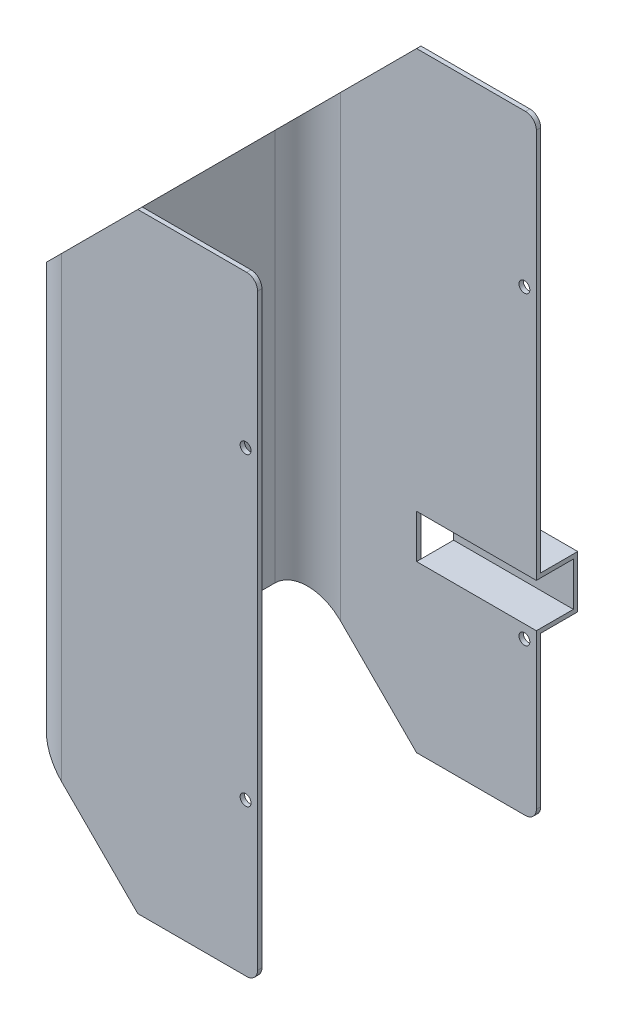
ISO-10303-21;
HEADER;
FILE_DESCRIPTION(('STEP AP214'),'2;1');
FILE_NAME('part.step','',(''),(''),'','','');
FILE_SCHEMA(('AUTOMOTIVE_DESIGN { 1 0 10303 214 1 1 1 1 }'));
ENDSEC;
DATA;
#1=APPLICATION_CONTEXT('core data for automotive mechanical design processes');
#2=APPLICATION_PROTOCOL_DEFINITION('international standard','automotive_design',2000,#1);
#3=PRODUCT_CONTEXT('',#1,'mechanical');
#4=PRODUCT('Part','Part','',(#3));
#5=PRODUCT_RELATED_PRODUCT_CATEGORY('part','',(#4));
#6=PRODUCT_DEFINITION_FORMATION('','',#4);
#7=PRODUCT_DEFINITION_CONTEXT('part definition',#1,'design');
#8=PRODUCT_DEFINITION('design','',#6,#7);
#9=PRODUCT_DEFINITION_SHAPE('','',#8);
#10=(LENGTH_UNIT() NAMED_UNIT(*) SI_UNIT(.MILLI.,.METRE.));
#11=(NAMED_UNIT(*) PLANE_ANGLE_UNIT() SI_UNIT($,.RADIAN.));
#12=(NAMED_UNIT(*) SI_UNIT($,.STERADIAN.) SOLID_ANGLE_UNIT());
#13=UNCERTAINTY_MEASURE_WITH_UNIT(LENGTH_MEASURE(1.E-05),#10,'distance_accuracy_value','');
#14=(GEOMETRIC_REPRESENTATION_CONTEXT(3) GLOBAL_UNCERTAINTY_ASSIGNED_CONTEXT((#13)) GLOBAL_UNIT_ASSIGNED_CONTEXT((#10,
#11,#12)) REPRESENTATION_CONTEXT('',''));
#15=CARTESIAN_POINT('',(0.,0.,0.));
#16=DIRECTION('',(0.,0.,1.));
#17=DIRECTION('',(1.,0.,0.));
#18=AXIS2_PLACEMENT_3D('',#15,#16,#17);
#19=CARTESIAN_POINT('',(15.,280.,-65.));
#20=DIRECTION('',(0.,0.,-1.));
#21=DIRECTION('',(-1.,0.,0.));
#22=AXIS2_PLACEMENT_3D('',#19,#20,#21);
#23=PLANE('',#22);
#24=CARTESIAN_POINT('',(99.5,70.,-65.));
#25=DIRECTION('',(0.,0.,1.));
#26=DIRECTION('',(1.,0.,0.));
#27=AXIS2_PLACEMENT_3D('',#24,#25,#26);
#28=CIRCLE('',#27,2.5);
#29=CARTESIAN_POINT('',(102.,70.,-65.));
#30=VERTEX_POINT('',#29);
#31=EDGE_CURVE('E354',#30,#30,#28,.T.);
#32=ORIENTED_EDGE('',*,*,#31,.T.);
#33=EDGE_LOOP('',(#32));
#34=FACE_BOUND('',#33,.T.);
#35=CARTESIAN_POINT('',(99.5,210.,-65.));
#36=DIRECTION('',(0.,0.,1.));
#37=DIRECTION('',(1.,0.,0.));
#38=AXIS2_PLACEMENT_3D('',#35,#36,#37);
#39=CIRCLE('',#38,2.50000000000001);
#40=CARTESIAN_POINT('',(102.,210.,-65.));
#41=VERTEX_POINT('',#40);
#42=EDGE_CURVE('E364',#41,#41,#39,.T.);
#43=ORIENTED_EDGE('',*,*,#42,.T.);
#44=EDGE_LOOP('',(#43));
#45=FACE_BOUND('',#44,.T.);
#46=DIRECTION('',(0.,-1.,0.));
#47=VECTOR('',#46,1.);
#48=CARTESIAN_POINT('',(105.,280.,-65.));
#49=LINE('',#48,#47);
#50=CARTESIAN_POINT('',(105.,275.,-65.));
#51=VERTEX_POINT('',#50);
#52=CARTESIAN_POINT('',(105.,98.,-65.));
#53=VERTEX_POINT('',#52);
#54=EDGE_CURVE('E422',#51,#53,#49,.T.);
#55=ORIENTED_EDGE('',*,*,#54,.T.);
#56=DIRECTION('',(-1.,0.,0.));
#57=VECTOR('',#56,1.);
#58=CARTESIAN_POINT('',(134.410882339705,98.,-65.));
#59=LINE('',#58,#57);
#60=CARTESIAN_POINT('',(50.,98.,-65.));
#61=VERTEX_POINT('',#60);
#62=EDGE_CURVE('E241',#53,#61,#59,.T.);
#63=ORIENTED_EDGE('',*,*,#62,.T.);
#64=DIRECTION('',(0.,-1.,0.));
#65=VECTOR('',#64,1.);
#66=CARTESIAN_POINT('',(50.,98.,-65.));
#67=LINE('',#66,#65);
#68=CARTESIAN_POINT('',(50.,96.,-65.));
#69=VERTEX_POINT('',#68);
#70=EDGE_CURVE('E259',#61,#69,#67,.T.);
#71=ORIENTED_EDGE('',*,*,#70,.T.);
#72=DIRECTION('',(0.,1.,0.));
#73=VECTOR('',#72,1.);
#74=CARTESIAN_POINT('',(50.,96.,-65.));
#75=LINE('',#74,#73);
#76=CARTESIAN_POINT('',(50.,76.,-65.));
#77=VERTEX_POINT('',#76);
#78=EDGE_CURVE('E252',#77,#69,#75,.T.);
#79=ORIENTED_EDGE('',*,*,#78,.F.);
#80=DIRECTION('',(0.,-1.,0.));
#81=VECTOR('',#80,1.);
#82=CARTESIAN_POINT('',(50.,76.,-65.));
#83=LINE('',#82,#81);
#84=CARTESIAN_POINT('',(50.,74.,-65.));
#85=VERTEX_POINT('',#84);
#86=EDGE_CURVE('E274',#77,#85,#83,.T.);
#87=ORIENTED_EDGE('',*,*,#86,.T.);
#88=DIRECTION('',(-1.,0.,0.));
#89=VECTOR('',#88,1.);
#90=CARTESIAN_POINT('',(134.410882339705,74.,-65.));
#91=LINE('',#90,#89);
#92=CARTESIAN_POINT('',(105.,74.,-65.));
#93=VERTEX_POINT('',#92);
#94=EDGE_CURVE('E271',#93,#85,#91,.T.);
#95=ORIENTED_EDGE('',*,*,#94,.F.);
#96=CARTESIAN_POINT('',(105.,5.,-65.));
#97=VERTEX_POINT('',#96);
#98=EDGE_CURVE('E421',#93,#97,#49,.T.);
#99=ORIENTED_EDGE('',*,*,#98,.T.);
#100=CARTESIAN_POINT('',(100.,5.,-65.));
#101=DIRECTION('',(0.,0.,-1.));
#102=DIRECTION('',(-1.,0.,0.));
#103=AXIS2_PLACEMENT_3D('',#100,#101,#102);
#104=CIRCLE('',#103,5.);
#105=CARTESIAN_POINT('',(100.,0.,-65.));
#106=VERTEX_POINT('',#105);
#107=EDGE_CURVE('E451',#97,#106,#104,.T.);
#108=ORIENTED_EDGE('',*,*,#107,.T.);
#109=DIRECTION('',(1.,0.,0.));
#110=VECTOR('',#109,1.);
#111=CARTESIAN_POINT('',(15.,0.,-65.));
#112=LINE('',#111,#110);
#113=CARTESIAN_POINT('',(50.,0.,-65.));
#114=VERTEX_POINT('',#113);
#115=EDGE_CURVE('E388',#114,#106,#112,.T.);
#116=ORIENTED_EDGE('',*,*,#115,.F.);
#117=DIRECTION('',(-0.707106781186547,0.707106781186547,0.));
#118=VECTOR('',#117,1.);
#119=CARTESIAN_POINT('',(50.,0.,-65.));
#120=LINE('',#119,#118);
#121=CARTESIAN_POINT('',(15.,35.,-65.));
#122=VERTEX_POINT('',#121);
#123=EDGE_CURVE('E294',#114,#122,#120,.T.);
#124=ORIENTED_EDGE('',*,*,#123,.T.);
#125=DIRECTION('',(0.,-1.,0.));
#126=VECTOR('',#125,1.);
#127=CARTESIAN_POINT('',(15.,280.,-65.));
#128=LINE('',#127,#126);
#129=CARTESIAN_POINT('',(15.,245.,-65.));
#130=VERTEX_POINT('',#129);
#131=EDGE_CURVE('E418',#130,#122,#128,.T.);
#132=ORIENTED_EDGE('',*,*,#131,.F.);
#133=DIRECTION('',(0.707106781186547,0.707106781186547,0.));
#134=VECTOR('',#133,1.);
#135=CARTESIAN_POINT('',(50.,280.,-65.));
#136=LINE('',#135,#134);
#137=CARTESIAN_POINT('',(50.,280.,-65.));
#138=VERTEX_POINT('',#137);
#139=EDGE_CURVE('E323',#130,#138,#136,.T.);
#140=ORIENTED_EDGE('',*,*,#139,.T.);
#141=DIRECTION('',(1.,0.,0.));
#142=VECTOR('',#141,1.);
#143=CARTESIAN_POINT('',(15.,280.,-65.));
#144=LINE('',#143,#142);
#145=CARTESIAN_POINT('',(100.,280.,-65.));
#146=VERTEX_POINT('',#145);
#147=EDGE_CURVE('E377',#138,#146,#144,.T.);
#148=ORIENTED_EDGE('',*,*,#147,.T.);
#149=CARTESIAN_POINT('',(100.,275.,-65.));
#150=DIRECTION('',(0.,0.,-1.));
#151=DIRECTION('',(-1.,0.,0.));
#152=AXIS2_PLACEMENT_3D('',#149,#150,#151);
#153=CIRCLE('',#152,5.);
#154=EDGE_CURVE('E449',#146,#51,#153,.T.);
#155=ORIENTED_EDGE('',*,*,#154,.T.);
#156=EDGE_LOOP('',(#55,#63,#71,#79,#87,#95,#99,#108,#116,#124,#132,#140,#148,#155));
#157=FACE_BOUND('',#156,.T.);
#158=ADVANCED_FACE('F34',(#34,#45,#157),#23,.T.);
#159=CARTESIAN_POINT('',(-1.99999999999998,0.,-48.));
#160=DIRECTION('',(0.,-1.,0.));
#161=DIRECTION('',(0.,0.,-1.));
#162=AXIS2_PLACEMENT_3D('',#159,#160,#161);
#163=PLANE('',#162);
#164=ORIENTED_EDGE('',*,*,#115,.T.);
#165=DIRECTION('',(0.,0.,1.));
#166=VECTOR('',#165,1.);
#167=CARTESIAN_POINT('',(100.,0.,-48.));
#168=LINE('',#167,#166);
#169=CARTESIAN_POINT('',(100.,0.,-63.));
#170=VERTEX_POINT('',#169);
#171=EDGE_CURVE('E435',#106,#170,#168,.T.);
#172=ORIENTED_EDGE('',*,*,#171,.T.);
#173=DIRECTION('',(1.,0.,0.));
#174=VECTOR('',#173,1.);
#175=CARTESIAN_POINT('',(15.,0.,-63.));
#176=LINE('',#175,#174);
#177=CARTESIAN_POINT('',(50.,0.,-63.));
#178=VERTEX_POINT('',#177);
#179=EDGE_CURVE('E373',#178,#170,#176,.T.);
#180=ORIENTED_EDGE('',*,*,#179,.F.);
#181=DIRECTION('',(0.,0.,1.));
#182=VECTOR('',#181,1.);
#183=CARTESIAN_POINT('',(50.,0.,-65.));
#184=LINE('',#183,#182);
#185=EDGE_CURVE('E299',#114,#178,#184,.T.);
#186=ORIENTED_EDGE('',*,*,#185,.F.);
#187=EDGE_LOOP('',(#164,#172,#180,#186));
#188=FACE_BOUND('',#187,.T.);
#189=ADVANCED_FACE('F558',(#188),#163,.T.);
#190=CARTESIAN_POINT('',(-1.99999999999998,280.,48.));
#191=DIRECTION('',(0.,1.,0.));
#192=DIRECTION('',(0.,0.,1.));
#193=AXIS2_PLACEMENT_3D('',#190,#191,#192);
#194=PLANE('',#193);
#195=DIRECTION('',(-1.,0.,0.));
#196=VECTOR('',#195,1.);
#197=CARTESIAN_POINT('',(15.,280.,65.));
#198=LINE('',#197,#196);
#199=CARTESIAN_POINT('',(100.,280.,65.));
#200=VERTEX_POINT('',#199);
#201=CARTESIAN_POINT('',(50.,280.,65.));
#202=VERTEX_POINT('',#201);
#203=EDGE_CURVE('E381',#200,#202,#198,.T.);
#204=ORIENTED_EDGE('',*,*,#203,.F.);
#205=DIRECTION('',(0.,0.,1.));
#206=VECTOR('',#205,1.);
#207=CARTESIAN_POINT('',(100.,280.,48.));
#208=LINE('',#207,#206);
#209=CARTESIAN_POINT('',(100.,280.,63.));
#210=VERTEX_POINT('',#209);
#211=EDGE_CURVE('E42',#200,#210,#208,.F.);
#212=ORIENTED_EDGE('',*,*,#211,.T.);
#213=DIRECTION('',(-1.,0.,0.));
#214=VECTOR('',#213,1.);
#215=CARTESIAN_POINT('',(15.,280.,63.));
#216=LINE('',#215,#214);
#217=CARTESIAN_POINT('',(50.,280.,63.));
#218=VERTEX_POINT('',#217);
#219=EDGE_CURVE('E383',#210,#218,#216,.T.);
#220=ORIENTED_EDGE('',*,*,#219,.T.);
#221=DIRECTION('',(0.,0.,1.));
#222=VECTOR('',#221,1.);
#223=CARTESIAN_POINT('',(50.,280.,-65.));
#224=LINE('',#223,#222);
#225=EDGE_CURVE('E333',#218,#202,#224,.T.);
#226=ORIENTED_EDGE('',*,*,#225,.T.);
#227=EDGE_LOOP('',(#204,#212,#220,#226));
#228=FACE_BOUND('',#227,.T.);
#229=ADVANCED_FACE('F491',(#228),#194,.T.);
#230=CARTESIAN_POINT('',(15.,280.,-63.));
#231=DIRECTION('',(0.,0.,-1.));
#232=DIRECTION('',(-1.,0.,0.));
#233=AXIS2_PLACEMENT_3D('',#230,#231,#232);
#234=PLANE('',#233);
#235=CARTESIAN_POINT('',(99.5,70.,-63.));
#236=DIRECTION('',(0.,0.,-1.));
#237=DIRECTION('',(-1.,0.,0.));
#238=AXIS2_PLACEMENT_3D('',#235,#236,#237);
#239=CIRCLE('',#238,2.5);
#240=CARTESIAN_POINT('',(97.,70.,-63.));
#241=VERTEX_POINT('',#240);
#242=EDGE_CURVE('E360',#241,#241,#239,.T.);
#243=ORIENTED_EDGE('',*,*,#242,.T.);
#244=EDGE_LOOP('',(#243));
#245=FACE_BOUND('',#244,.T.);
#246=CARTESIAN_POINT('',(99.5,210.,-63.));
#247=DIRECTION('',(0.,0.,-1.));
#248=DIRECTION('',(-1.,0.,0.));
#249=AXIS2_PLACEMENT_3D('',#246,#247,#248);
#250=CIRCLE('',#249,2.50000000000001);
#251=CARTESIAN_POINT('',(97.,210.,-63.));
#252=VERTEX_POINT('',#251);
#253=EDGE_CURVE('E370',#252,#252,#250,.T.);
#254=ORIENTED_EDGE('',*,*,#253,.T.);
#255=EDGE_LOOP('',(#254));
#256=FACE_BOUND('',#255,.T.);
#257=DIRECTION('',(0.,-1.,0.));
#258=VECTOR('',#257,1.);
#259=CARTESIAN_POINT('',(50.,96.,-63.));
#260=LINE('',#259,#258);
#261=CARTESIAN_POINT('',(50.,96.,-63.));
#262=VERTEX_POINT('',#261);
#263=CARTESIAN_POINT('',(50.,76.,-63.));
#264=VERTEX_POINT('',#263);
#265=EDGE_CURVE('E278',#262,#264,#260,.T.);
#266=ORIENTED_EDGE('',*,*,#265,.F.);
#267=DIRECTION('',(-1.,0.,0.));
#268=VECTOR('',#267,1.);
#269=CARTESIAN_POINT('',(105.,96.,-63.));
#270=LINE('',#269,#268);
#271=CARTESIAN_POINT('',(105.,96.,-63.));
#272=VERTEX_POINT('',#271);
#273=EDGE_CURVE('E280',#272,#262,#270,.T.);
#274=ORIENTED_EDGE('',*,*,#273,.F.);
#275=DIRECTION('',(0.,-1.,0.));
#276=VECTOR('',#275,1.);
#277=CARTESIAN_POINT('',(105.,280.,-63.));
#278=LINE('',#277,#276);
#279=CARTESIAN_POINT('',(105.,275.,-63.));
#280=VERTEX_POINT('',#279);
#281=EDGE_CURVE('E425',#280,#272,#278,.T.);
#282=ORIENTED_EDGE('',*,*,#281,.F.);
#283=CARTESIAN_POINT('',(100.,275.,-63.));
#284=DIRECTION('',(0.,0.,-1.));
#285=DIRECTION('',(-1.,0.,0.));
#286=AXIS2_PLACEMENT_3D('',#283,#284,#285);
#287=CIRCLE('',#286,5.);
#288=CARTESIAN_POINT('',(100.,280.,-63.));
#289=VERTEX_POINT('',#288);
#290=EDGE_CURVE('E438',#280,#289,#287,.F.);
#291=ORIENTED_EDGE('',*,*,#290,.T.);
#292=DIRECTION('',(1.,0.,0.));
#293=VECTOR('',#292,1.);
#294=CARTESIAN_POINT('',(15.,280.,-63.));
#295=LINE('',#294,#293);
#296=CARTESIAN_POINT('',(50.,280.,-63.));
#297=VERTEX_POINT('',#296);
#298=EDGE_CURVE('E374',#297,#289,#295,.T.);
#299=ORIENTED_EDGE('',*,*,#298,.F.);
#300=DIRECTION('',(-0.707106781186548,-0.707106781186548,0.));
#301=VECTOR('',#300,1.);
#302=CARTESIAN_POINT('',(32.5,262.5,-63.));
#303=LINE('',#302,#301);
#304=CARTESIAN_POINT('',(15.,245.,-63.));
#305=VERTEX_POINT('',#304);
#306=EDGE_CURVE('E346',#297,#305,#303,.T.);
#307=ORIENTED_EDGE('',*,*,#306,.T.);
#308=DIRECTION('',(0.,-1.,0.));
#309=VECTOR('',#308,1.);
#310=CARTESIAN_POINT('',(15.,280.,-63.));
#311=LINE('',#310,#309);
#312=CARTESIAN_POINT('',(15.,35.,-63.));
#313=VERTEX_POINT('',#312);
#314=EDGE_CURVE('E385',#305,#313,#311,.T.);
#315=ORIENTED_EDGE('',*,*,#314,.T.);
#316=DIRECTION('',(0.707106781186548,-0.707106781186548,0.));
#317=VECTOR('',#316,1.);
#318=CARTESIAN_POINT('',(-107.5,157.5,-62.9999999999999));
#319=LINE('',#318,#317);
#320=EDGE_CURVE('E315',#313,#178,#319,.T.);
#321=ORIENTED_EDGE('',*,*,#320,.T.);
#322=ORIENTED_EDGE('',*,*,#179,.T.);
#323=CARTESIAN_POINT('',(100.,5.,-63.));
#324=DIRECTION('',(0.,0.,-1.));
#325=DIRECTION('',(-1.,0.,0.));
#326=AXIS2_PLACEMENT_3D('',#323,#324,#325);
#327=CIRCLE('',#326,5.);
#328=CARTESIAN_POINT('',(105.,5.,-63.));
#329=VERTEX_POINT('',#328);
#330=EDGE_CURVE('E440',#170,#329,#327,.F.);
#331=ORIENTED_EDGE('',*,*,#330,.T.);
#332=CARTESIAN_POINT('',(105.,76.,-63.));
#333=VERTEX_POINT('',#332);
#334=EDGE_CURVE('E424',#333,#329,#278,.T.);
#335=ORIENTED_EDGE('',*,*,#334,.F.);
#336=DIRECTION('',(1.,0.,0.));
#337=VECTOR('',#336,1.);
#338=CARTESIAN_POINT('',(105.,76.,-63.));
#339=LINE('',#338,#337);
#340=EDGE_CURVE('E282',#264,#333,#339,.T.);
#341=ORIENTED_EDGE('',*,*,#340,.F.);
#342=EDGE_LOOP('',(#266,#274,#282,#291,#299,#307,#315,#321,#322,#331,#335,#341));
#343=FACE_BOUND('',#342,.T.);
#344=ADVANCED_FACE('F508',(#245,#256,#343),#234,.F.);
#345=CARTESIAN_POINT('',(105.,280.,-65.));
#346=DIRECTION('',(1.,0.,0.));
#347=DIRECTION('',(0.,0.,-1.));
#348=AXIS2_PLACEMENT_3D('',#345,#346,#347);
#349=PLANE('',#348);
#350=DIRECTION('',(0.,0.,-1.));
#351=VECTOR('',#350,1.);
#352=CARTESIAN_POINT('',(105.,76.,-4.4765004464019));
#353=LINE('',#352,#351);
#354=CARTESIAN_POINT('',(105.,76.,-80.));
#355=VERTEX_POINT('',#354);
#356=EDGE_CURVE('E255',#333,#355,#353,.T.);
#357=ORIENTED_EDGE('',*,*,#356,.F.);
#358=ORIENTED_EDGE('',*,*,#334,.T.);
#359=DIRECTION('',(0.,0.,1.));
#360=VECTOR('',#359,1.);
#361=CARTESIAN_POINT('',(105.,5.,-65.));
#362=LINE('',#361,#360);
#363=EDGE_CURVE('E446',#329,#97,#362,.F.);
#364=ORIENTED_EDGE('',*,*,#363,.T.);
#365=ORIENTED_EDGE('',*,*,#98,.F.);
#366=DIRECTION('',(0.,0.,-1.));
#367=VECTOR('',#366,1.);
#368=CARTESIAN_POINT('',(105.,74.,-82.));
#369=LINE('',#368,#367);
#370=CARTESIAN_POINT('',(105.,74.,-82.));
#371=VERTEX_POINT('',#370);
#372=EDGE_CURVE('E251',#93,#371,#369,.T.);
#373=ORIENTED_EDGE('',*,*,#372,.T.);
#374=DIRECTION('',(0.,1.,0.));
#375=VECTOR('',#374,1.);
#376=CARTESIAN_POINT('',(105.,98.,-82.));
#377=LINE('',#376,#375);
#378=CARTESIAN_POINT('',(105.,98.,-82.));
#379=VERTEX_POINT('',#378);
#380=EDGE_CURVE('E229',#371,#379,#377,.T.);
#381=ORIENTED_EDGE('',*,*,#380,.T.);
#382=DIRECTION('',(0.,0.,1.));
#383=VECTOR('',#382,1.);
#384=CARTESIAN_POINT('',(105.,98.,-65.));
#385=LINE('',#384,#383);
#386=EDGE_CURVE('E238',#379,#53,#385,.T.);
#387=ORIENTED_EDGE('',*,*,#386,.T.);
#388=ORIENTED_EDGE('',*,*,#54,.F.);
#389=DIRECTION('',(0.,0.,1.));
#390=VECTOR('',#389,1.);
#391=CARTESIAN_POINT('',(105.,275.,-65.));
#392=LINE('',#391,#390);
#393=EDGE_CURVE('E443',#51,#280,#392,.T.);
#394=ORIENTED_EDGE('',*,*,#393,.T.);
#395=ORIENTED_EDGE('',*,*,#281,.T.);
#396=DIRECTION('',(0.,0.,-1.));
#397=VECTOR('',#396,1.);
#398=CARTESIAN_POINT('',(105.,96.,-4.4765004464019));
#399=LINE('',#398,#397);
#400=CARTESIAN_POINT('',(105.,96.,-80.));
#401=VERTEX_POINT('',#400);
#402=EDGE_CURVE('E281',#272,#401,#399,.T.);
#403=ORIENTED_EDGE('',*,*,#402,.T.);
#404=DIRECTION('',(0.,-1.,0.));
#405=VECTOR('',#404,1.);
#406=CARTESIAN_POINT('',(105.,96.,-80.));
#407=LINE('',#406,#405);
#408=EDGE_CURVE('E245',#401,#355,#407,.T.);
#409=ORIENTED_EDGE('',*,*,#408,.T.);
#410=EDGE_LOOP('',(#357,#358,#364,#365,#373,#381,#387,#388,#394,#395,#403,#409));
#411=FACE_BOUND('',#410,.T.);
#412=ADVANCED_FACE('F249',(#411),#349,.T.);
#413=CARTESIAN_POINT('',(15.,280.,-48.));
#414=DIRECTION('',(0.,-1.,0.));
#415=DIRECTION('',(0.,0.,-1.));
#416=AXIS2_PLACEMENT_3D('',#413,#414,#415);
#417=CYLINDRICAL_SURFACE('',#416,17.);
#418=CARTESIAN_POINT('',(15.,35.,-48.));
#419=DIRECTION('',(0.707106781186547,0.707106781186547,0.));
#420=DIRECTION('',(0.707106781186548,-0.707106781186548,0.));
#421=AXIS2_PLACEMENT_3D('',#418,#419,#420);
#422=ELLIPSE('',#421,24.0416305603426,17.);
#423=CARTESIAN_POINT('',(-1.99999999999998,52.,-48.));
#424=VERTEX_POINT('',#423);
#425=EDGE_CURVE('E320',#424,#122,#422,.F.);
#426=ORIENTED_EDGE('',*,*,#425,.F.);
#427=DIRECTION('',(0.,-1.,0.));
#428=VECTOR('',#427,1.);
#429=CARTESIAN_POINT('',(-1.99999999999998,280.,-48.));
#430=LINE('',#429,#428);
#431=CARTESIAN_POINT('',(-1.99999999999998,228.,-48.));
#432=VERTEX_POINT('',#431);
#433=EDGE_CURVE('E415',#432,#424,#430,.T.);
#434=ORIENTED_EDGE('',*,*,#433,.F.);
#435=CARTESIAN_POINT('',(15.,245.,-48.));
#436=DIRECTION('',(0.707106781186547,-0.707106781186547,0.));
#437=DIRECTION('',(-0.707106781186548,-0.707106781186548,0.));
#438=AXIS2_PLACEMENT_3D('',#435,#436,#437);
#439=ELLIPSE('',#438,24.0416305603426,17.);
#440=EDGE_CURVE('E351',#130,#432,#439,.F.);
#441=ORIENTED_EDGE('',*,*,#440,.F.);
#442=ORIENTED_EDGE('',*,*,#131,.T.);
#443=EDGE_LOOP('',(#426,#434,#441,#442));
#444=FACE_BOUND('',#443,.T.);
#445=ADVANCED_FACE('F587',(#444),#417,.T.);
#446=CARTESIAN_POINT('',(-1.99999999999998,280.,-48.));
#447=DIRECTION('',(-1.,0.,0.));
#448=DIRECTION('',(0.,0.,1.));
#449=AXIS2_PLACEMENT_3D('',#446,#447,#448);
#450=PLANE('',#449);
#451=DIRECTION('',(0.,0.,1.));
#452=VECTOR('',#451,1.);
#453=CARTESIAN_POINT('',(-1.99999999999998,52.,-65.));
#454=LINE('',#453,#452);
#455=CARTESIAN_POINT('',(-1.99999999999998,52.,48.));
#456=VERTEX_POINT('',#455);
#457=EDGE_CURVE('E297',#424,#456,#454,.T.);
#458=ORIENTED_EDGE('',*,*,#457,.T.);
#459=DIRECTION('',(0.,-1.,0.));
#460=VECTOR('',#459,1.);
#461=CARTESIAN_POINT('',(-1.99999999999998,280.,48.));
#462=LINE('',#461,#460);
#463=CARTESIAN_POINT('',(-1.99999999999998,228.,48.));
#464=VERTEX_POINT('',#463);
#465=EDGE_CURVE('E412',#464,#456,#462,.T.);
#466=ORIENTED_EDGE('',*,*,#465,.F.);
#467=DIRECTION('',(0.,0.,1.));
#468=VECTOR('',#467,1.);
#469=CARTESIAN_POINT('',(-1.99999999999998,228.,-65.));
#470=LINE('',#469,#468);
#471=EDGE_CURVE('E326',#432,#464,#470,.T.);
#472=ORIENTED_EDGE('',*,*,#471,.F.);
#473=ORIENTED_EDGE('',*,*,#433,.T.);
#474=EDGE_LOOP('',(#458,#466,#472,#473));
#475=FACE_BOUND('',#474,.T.);
#476=ADVANCED_FACE('F644',(#475),#450,.T.);
#477=CARTESIAN_POINT('',(15.,280.,48.));
#478=DIRECTION('',(0.,-1.,0.));
#479=DIRECTION('',(0.,0.,-1.));
#480=AXIS2_PLACEMENT_3D('',#477,#478,#479);
#481=CYLINDRICAL_SURFACE('',#480,17.);
#482=CARTESIAN_POINT('',(15.,35.,48.));
#483=DIRECTION('',(0.707106781186547,0.707106781186547,0.));
#484=DIRECTION('',(0.707106781186548,-0.707106781186548,0.));
#485=AXIS2_PLACEMENT_3D('',#482,#483,#484);
#486=ELLIPSE('',#485,24.0416305603426,17.);
#487=CARTESIAN_POINT('',(15.,35.,65.));
#488=VERTEX_POINT('',#487);
#489=EDGE_CURVE('E318',#488,#456,#486,.F.);
#490=ORIENTED_EDGE('',*,*,#489,.F.);
#491=DIRECTION('',(0.,-1.,0.));
#492=VECTOR('',#491,1.);
#493=CARTESIAN_POINT('',(15.,280.,65.));
#494=LINE('',#493,#492);
#495=CARTESIAN_POINT('',(15.,245.,65.));
#496=VERTEX_POINT('',#495);
#497=EDGE_CURVE('E409',#496,#488,#494,.T.);
#498=ORIENTED_EDGE('',*,*,#497,.F.);
#499=CARTESIAN_POINT('',(15.,245.,48.));
#500=DIRECTION('',(0.707106781186547,-0.707106781186547,0.));
#501=DIRECTION('',(-0.707106781186548,-0.707106781186548,0.));
#502=AXIS2_PLACEMENT_3D('',#499,#500,#501);
#503=ELLIPSE('',#502,24.0416305603426,17.);
#504=EDGE_CURVE('E349',#464,#496,#503,.F.);
#505=ORIENTED_EDGE('',*,*,#504,.F.);
#506=ORIENTED_EDGE('',*,*,#465,.T.);
#507=EDGE_LOOP('',(#490,#498,#505,#506));
#508=FACE_BOUND('',#507,.T.);
#509=ADVANCED_FACE('F642',(#508),#481,.T.);
#510=CARTESIAN_POINT('',(15.,280.,65.));
#511=DIRECTION('',(0.,0.,1.));
#512=DIRECTION('',(1.,0.,0.));
#513=AXIS2_PLACEMENT_3D('',#510,#511,#512);
#514=PLANE('',#513);
#515=DIRECTION('',(-1.,0.,0.));
#516=VECTOR('',#515,1.);
#517=CARTESIAN_POINT('',(15.,0.,65.));
#518=LINE('',#517,#516);
#519=CARTESIAN_POINT('',(100.,0.,65.));
#520=VERTEX_POINT('',#519);
#521=CARTESIAN_POINT('',(50.,0.,65.));
#522=VERTEX_POINT('',#521);
#523=EDGE_CURVE('E391',#520,#522,#518,.T.);
#524=ORIENTED_EDGE('',*,*,#523,.F.);
#525=CARTESIAN_POINT('',(100.,5.,65.));
#526=DIRECTION('',(0.,0.,1.));
#527=DIRECTION('',(1.,0.,0.));
#528=AXIS2_PLACEMENT_3D('',#525,#526,#527);
#529=CIRCLE('',#528,5.);
#530=CARTESIAN_POINT('',(105.,5.,65.));
#531=VERTEX_POINT('',#530);
#532=EDGE_CURVE('E458',#520,#531,#529,.T.);
#533=ORIENTED_EDGE('',*,*,#532,.T.);
#534=DIRECTION('',(0.,-1.,0.));
#535=VECTOR('',#534,1.);
#536=CARTESIAN_POINT('',(105.,280.,65.));
#537=LINE('',#536,#535);
#538=CARTESIAN_POINT('',(105.,275.,65.));
#539=VERTEX_POINT('',#538);
#540=EDGE_CURVE('E407',#539,#531,#537,.T.);
#541=ORIENTED_EDGE('',*,*,#540,.F.);
#542=CARTESIAN_POINT('',(100.,275.,65.));
#543=DIRECTION('',(0.,0.,1.));
#544=DIRECTION('',(1.,0.,0.));
#545=AXIS2_PLACEMENT_3D('',#542,#543,#544);
#546=CIRCLE('',#545,5.);
#547=EDGE_CURVE('E456',#539,#200,#546,.T.);
#548=ORIENTED_EDGE('',*,*,#547,.T.);
#549=ORIENTED_EDGE('',*,*,#203,.T.);
#550=DIRECTION('',(0.707106781186547,0.707106781186547,0.));
#551=VECTOR('',#550,1.);
#552=CARTESIAN_POINT('',(50.,280.,65.));
#553=LINE('',#552,#551);
#554=EDGE_CURVE('E322',#496,#202,#553,.T.);
#555=ORIENTED_EDGE('',*,*,#554,.F.);
#556=ORIENTED_EDGE('',*,*,#497,.T.);
#557=DIRECTION('',(-0.707106781186547,0.707106781186547,0.));
#558=VECTOR('',#557,1.);
#559=CARTESIAN_POINT('',(50.,0.,65.));
#560=LINE('',#559,#558);
#561=EDGE_CURVE('E293',#522,#488,#560,.T.);
#562=ORIENTED_EDGE('',*,*,#561,.F.);
#563=EDGE_LOOP('',(#524,#533,#541,#548,#549,#555,#556,#562));
#564=FACE_BOUND('',#563,.T.);
#565=CARTESIAN_POINT('',(99.5,70.,65.));
#566=DIRECTION('',(0.,0.,1.));
#567=DIRECTION('',(1.,0.,0.));
#568=AXIS2_PLACEMENT_3D('',#565,#566,#567);
#569=CIRCLE('',#568,2.5);
#570=CARTESIAN_POINT('',(102.,70.,65.));
#571=VERTEX_POINT('',#570);
#572=EDGE_CURVE('E353',#571,#571,#569,.T.);
#573=ORIENTED_EDGE('',*,*,#572,.F.);
#574=EDGE_LOOP('',(#573));
#575=FACE_BOUND('',#574,.T.);
#576=CARTESIAN_POINT('',(99.5,210.,65.));
#577=DIRECTION('',(0.,0.,1.));
#578=DIRECTION('',(1.,0.,0.));
#579=AXIS2_PLACEMENT_3D('',#576,#577,#578);
#580=CIRCLE('',#579,2.50000000000001);
#581=CARTESIAN_POINT('',(102.,210.,65.));
#582=VERTEX_POINT('',#581);
#583=EDGE_CURVE('E363',#582,#582,#580,.T.);
#584=ORIENTED_EDGE('',*,*,#583,.F.);
#585=EDGE_LOOP('',(#584));
#586=FACE_BOUND('',#585,.T.);
#587=ADVANCED_FACE('F481',(#564,#575,#586),#514,.T.);
#588=CARTESIAN_POINT('',(105.,280.,63.));
#589=DIRECTION('',(1.,0.,0.));
#590=DIRECTION('',(0.,0.,-1.));
#591=AXIS2_PLACEMENT_3D('',#588,#589,#590);
#592=PLANE('',#591);
#593=ORIENTED_EDGE('',*,*,#540,.T.);
#594=DIRECTION('',(0.,0.,1.));
#595=VECTOR('',#594,1.);
#596=CARTESIAN_POINT('',(105.,5.,63.));
#597=LINE('',#596,#595);
#598=CARTESIAN_POINT('',(105.,5.,63.));
#599=VERTEX_POINT('',#598);
#600=EDGE_CURVE('E56',#531,#599,#597,.F.);
#601=ORIENTED_EDGE('',*,*,#600,.T.);
#602=DIRECTION('',(0.,-1.,0.));
#603=VECTOR('',#602,1.);
#604=CARTESIAN_POINT('',(105.,280.,63.));
#605=LINE('',#604,#603);
#606=CARTESIAN_POINT('',(105.,275.,63.));
#607=VERTEX_POINT('',#606);
#608=EDGE_CURVE('E405',#607,#599,#605,.T.);
#609=ORIENTED_EDGE('',*,*,#608,.F.);
#610=DIRECTION('',(0.,0.,1.));
#611=VECTOR('',#610,1.);
#612=CARTESIAN_POINT('',(105.,275.,63.));
#613=LINE('',#612,#611);
#614=EDGE_CURVE('E460',#607,#539,#613,.T.);
#615=ORIENTED_EDGE('',*,*,#614,.T.);
#616=EDGE_LOOP('',(#593,#601,#609,#615));
#617=FACE_BOUND('',#616,.T.);
#618=ADVANCED_FACE('F484',(#617),#592,.T.);
#619=CARTESIAN_POINT('',(15.,280.,63.));
#620=DIRECTION('',(0.,0.,1.));
#621=DIRECTION('',(1.,0.,0.));
#622=AXIS2_PLACEMENT_3D('',#619,#620,#621);
#623=PLANE('',#622);
#624=CARTESIAN_POINT('',(99.5,70.,63.));
#625=DIRECTION('',(0.,0.,1.));
#626=DIRECTION('',(1.,0.,0.));
#627=AXIS2_PLACEMENT_3D('',#624,#625,#626);
#628=CIRCLE('',#627,2.5);
#629=CARTESIAN_POINT('',(102.,70.,63.));
#630=VERTEX_POINT('',#629);
#631=EDGE_CURVE('E357',#630,#630,#628,.T.);
#632=ORIENTED_EDGE('',*,*,#631,.T.);
#633=EDGE_LOOP('',(#632));
#634=FACE_BOUND('',#633,.T.);
#635=CARTESIAN_POINT('',(99.5,210.,63.));
#636=DIRECTION('',(0.,0.,1.));
#637=DIRECTION('',(1.,0.,0.));
#638=AXIS2_PLACEMENT_3D('',#635,#636,#637);
#639=CIRCLE('',#638,2.50000000000001);
#640=CARTESIAN_POINT('',(102.,210.,63.));
#641=VERTEX_POINT('',#640);
#642=EDGE_CURVE('E367',#641,#641,#639,.T.);
#643=ORIENTED_EDGE('',*,*,#642,.T.);
#644=EDGE_LOOP('',(#643));
#645=FACE_BOUND('',#644,.T.);
#646=ORIENTED_EDGE('',*,*,#608,.T.);
#647=CARTESIAN_POINT('',(100.,5.,63.));
#648=DIRECTION('',(0.,0.,1.));
#649=DIRECTION('',(1.,0.,0.));
#650=AXIS2_PLACEMENT_3D('',#647,#648,#649);
#651=CIRCLE('',#650,5.);
#652=CARTESIAN_POINT('',(100.,0.,63.));
#653=VERTEX_POINT('',#652);
#654=EDGE_CURVE('E466',#599,#653,#651,.F.);
#655=ORIENTED_EDGE('',*,*,#654,.T.);
#656=DIRECTION('',(-1.,0.,0.));
#657=VECTOR('',#656,1.);
#658=CARTESIAN_POINT('',(15.,0.,63.));
#659=LINE('',#658,#657);
#660=CARTESIAN_POINT('',(50.,0.,63.));
#661=VERTEX_POINT('',#660);
#662=EDGE_CURVE('E378',#653,#661,#659,.T.);
#663=ORIENTED_EDGE('',*,*,#662,.T.);
#664=DIRECTION('',(-0.707106781186548,0.707106781186548,0.));
#665=VECTOR('',#664,1.);
#666=CARTESIAN_POINT('',(-107.5,157.5,62.9999999999999));
#667=LINE('',#666,#665);
#668=CARTESIAN_POINT('',(15.,35.,63.));
#669=VERTEX_POINT('',#668);
#670=EDGE_CURVE('E312',#661,#669,#667,.T.);
#671=ORIENTED_EDGE('',*,*,#670,.T.);
#672=DIRECTION('',(0.,-1.,0.));
#673=VECTOR('',#672,1.);
#674=CARTESIAN_POINT('',(15.,280.,63.));
#675=LINE('',#674,#673);
#676=CARTESIAN_POINT('',(15.,245.,63.));
#677=VERTEX_POINT('',#676);
#678=EDGE_CURVE('E402',#677,#669,#675,.T.);
#679=ORIENTED_EDGE('',*,*,#678,.F.);
#680=DIRECTION('',(0.707106781186548,0.707106781186548,0.));
#681=VECTOR('',#680,1.);
#682=CARTESIAN_POINT('',(32.5,262.5,63.));
#683=LINE('',#682,#681);
#684=EDGE_CURVE('E343',#677,#218,#683,.T.);
#685=ORIENTED_EDGE('',*,*,#684,.T.);
#686=ORIENTED_EDGE('',*,*,#219,.F.);
#687=CARTESIAN_POINT('',(100.,275.,63.));
#688=DIRECTION('',(0.,0.,1.));
#689=DIRECTION('',(1.,0.,0.));
#690=AXIS2_PLACEMENT_3D('',#687,#688,#689);
#691=CIRCLE('',#690,5.);
#692=EDGE_CURVE('E464',#210,#607,#691,.F.);
#693=ORIENTED_EDGE('',*,*,#692,.T.);
#694=EDGE_LOOP('',(#646,#655,#663,#671,#679,#685,#686,#693));
#695=FACE_BOUND('',#694,.T.);
#696=ADVANCED_FACE('F470',(#634,#645,#695),#623,.F.);
#697=CARTESIAN_POINT('',(15.,280.,48.));
#698=DIRECTION('',(0.,-1.,0.));
#699=DIRECTION('',(0.,0.,-1.));
#700=AXIS2_PLACEMENT_3D('',#697,#698,#699);
#701=CYLINDRICAL_SURFACE('',#700,15.);
#702=ORIENTED_EDGE('',*,*,#678,.T.);
#703=CARTESIAN_POINT('',(15.,35.,48.));
#704=DIRECTION('',(0.707106781186547,0.707106781186547,0.));
#705=DIRECTION('',(0.707106781186548,-0.707106781186548,0.));
#706=AXIS2_PLACEMENT_3D('',#703,#704,#705);
#707=ELLIPSE('',#706,21.2132034355964,15.);
#708=CARTESIAN_POINT('',(0.,50.,48.));
#709=VERTEX_POINT('',#708);
#710=EDGE_CURVE('E309',#669,#709,#707,.F.);
#711=ORIENTED_EDGE('',*,*,#710,.T.);
#712=DIRECTION('',(0.,-1.,0.));
#713=VECTOR('',#712,1.);
#714=CARTESIAN_POINT('',(0.,280.,48.));
#715=LINE('',#714,#713);
#716=CARTESIAN_POINT('',(0.,230.,48.));
#717=VERTEX_POINT('',#716);
#718=EDGE_CURVE('E399',#717,#709,#715,.T.);
#719=ORIENTED_EDGE('',*,*,#718,.F.);
#720=CARTESIAN_POINT('',(15.,245.,48.));
#721=DIRECTION('',(0.707106781186547,-0.707106781186547,0.));
#722=DIRECTION('',(-0.707106781186548,-0.707106781186548,0.));
#723=AXIS2_PLACEMENT_3D('',#720,#721,#722);
#724=ELLIPSE('',#723,21.2132034355964,15.);
#725=EDGE_CURVE('E340',#717,#677,#724,.F.);
#726=ORIENTED_EDGE('',*,*,#725,.T.);
#727=EDGE_LOOP('',(#702,#711,#719,#726));
#728=FACE_BOUND('',#727,.T.);
#729=ADVANCED_FACE('F497',(#728),#701,.F.);
#730=CARTESIAN_POINT('',(0.,280.,-48.));
#731=DIRECTION('',(-1.,0.,0.));
#732=DIRECTION('',(0.,0.,1.));
#733=AXIS2_PLACEMENT_3D('',#730,#731,#732);
#734=PLANE('',#733);
#735=ORIENTED_EDGE('',*,*,#718,.T.);
#736=DIRECTION('',(0.,0.,-1.));
#737=VECTOR('',#736,1.);
#738=CARTESIAN_POINT('',(0.,50.,-48.));
#739=LINE('',#738,#737);
#740=CARTESIAN_POINT('',(0.,50.,-48.));
#741=VERTEX_POINT('',#740);
#742=EDGE_CURVE('E306',#709,#741,#739,.T.);
#743=ORIENTED_EDGE('',*,*,#742,.T.);
#744=DIRECTION('',(0.,-1.,0.));
#745=VECTOR('',#744,1.);
#746=CARTESIAN_POINT('',(0.,280.,-48.));
#747=LINE('',#746,#745);
#748=CARTESIAN_POINT('',(0.,230.,-48.));
#749=VERTEX_POINT('',#748);
#750=EDGE_CURVE('E396',#749,#741,#747,.T.);
#751=ORIENTED_EDGE('',*,*,#750,.F.);
#752=DIRECTION('',(0.,0.,1.));
#753=VECTOR('',#752,1.);
#754=CARTESIAN_POINT('',(0.,230.,-48.));
#755=LINE('',#754,#753);
#756=EDGE_CURVE('E337',#749,#717,#755,.T.);
#757=ORIENTED_EDGE('',*,*,#756,.T.);
#758=EDGE_LOOP('',(#735,#743,#751,#757));
#759=FACE_BOUND('',#758,.T.);
#760=ADVANCED_FACE('F501',(#759),#734,.F.);
#761=CARTESIAN_POINT('',(15.,280.,-48.));
#762=DIRECTION('',(0.,-1.,0.));
#763=DIRECTION('',(0.,0.,-1.));
#764=AXIS2_PLACEMENT_3D('',#761,#762,#763);
#765=CYLINDRICAL_SURFACE('',#764,15.);
#766=ORIENTED_EDGE('',*,*,#750,.T.);
#767=CARTESIAN_POINT('',(15.,35.,-48.));
#768=DIRECTION('',(0.707106781186547,0.707106781186547,0.));
#769=DIRECTION('',(0.707106781186548,-0.707106781186548,0.));
#770=AXIS2_PLACEMENT_3D('',#767,#768,#769);
#771=ELLIPSE('',#770,21.2132034355964,15.);
#772=EDGE_CURVE('E301',#741,#313,#771,.F.);
#773=ORIENTED_EDGE('',*,*,#772,.T.);
#774=ORIENTED_EDGE('',*,*,#314,.F.);
#775=CARTESIAN_POINT('',(15.,245.,-48.));
#776=DIRECTION('',(0.707106781186547,-0.707106781186547,0.));
#777=DIRECTION('',(-0.707106781186548,-0.707106781186548,0.));
#778=AXIS2_PLACEMENT_3D('',#775,#776,#777);
#779=ELLIPSE('',#778,21.2132034355964,15.);
#780=EDGE_CURVE('E332',#305,#749,#779,.F.);
#781=ORIENTED_EDGE('',*,*,#780,.T.);
#782=EDGE_LOOP('',(#766,#773,#774,#781));
#783=FACE_BOUND('',#782,.T.);
#784=ADVANCED_FACE('F503',(#783),#765,.F.);
#785=CARTESIAN_POINT('',(15.,280.,-48.));
#786=DIRECTION('',(0.,1.,0.));
#787=DIRECTION('',(0.,0.,1.));
#788=AXIS2_PLACEMENT_3D('',#785,#786,#787);
#789=PLANE('',#788);
#790=ORIENTED_EDGE('',*,*,#298,.T.);
#791=DIRECTION('',(0.,0.,1.));
#792=VECTOR('',#791,1.);
#793=CARTESIAN_POINT('',(100.,280.,-48.));
#794=LINE('',#793,#792);
#795=EDGE_CURVE('E11',#289,#146,#794,.F.);
#796=ORIENTED_EDGE('',*,*,#795,.T.);
#797=ORIENTED_EDGE('',*,*,#147,.F.);
#798=EDGE_CURVE('E329',#138,#297,#224,.T.);
#799=ORIENTED_EDGE('',*,*,#798,.T.);
#800=EDGE_LOOP('',(#790,#796,#797,#799));
#801=FACE_BOUND('',#800,.T.);
#802=ADVANCED_FACE('F512',(#801),#789,.T.);
#803=CARTESIAN_POINT('',(15.,0.,-48.));
#804=DIRECTION('',(0.,1.,0.));
#805=DIRECTION('',(0.,0.,1.));
#806=AXIS2_PLACEMENT_3D('',#803,#804,#805);
#807=PLANE('',#806);
#808=ORIENTED_EDGE('',*,*,#662,.F.);
#809=DIRECTION('',(0.,0.,1.));
#810=VECTOR('',#809,1.);
#811=CARTESIAN_POINT('',(100.,0.,65.));
#812=LINE('',#811,#810);
#813=EDGE_CURVE('E453',#653,#520,#812,.T.);
#814=ORIENTED_EDGE('',*,*,#813,.T.);
#815=ORIENTED_EDGE('',*,*,#523,.T.);
#816=DIRECTION('',(0.,0.,-1.));
#817=VECTOR('',#816,1.);
#818=CARTESIAN_POINT('',(50.,0.,-48.));
#819=LINE('',#818,#817);
#820=EDGE_CURVE('E428',#522,#661,#819,.T.);
#821=ORIENTED_EDGE('',*,*,#820,.T.);
#822=EDGE_LOOP('',(#808,#814,#815,#821));
#823=FACE_BOUND('',#822,.T.);
#824=ADVANCED_FACE('F475',(#823),#807,.F.);
#825=CARTESIAN_POINT('',(99.5,210.,-65.));
#826=DIRECTION('',(0.,0.,1.));
#827=DIRECTION('',(1.,0.,0.));
#828=AXIS2_PLACEMENT_3D('',#825,#826,#827);
#829=CYLINDRICAL_SURFACE('',#828,2.50000000000001);
#830=ORIENTED_EDGE('',*,*,#583,.T.);
#831=EDGE_LOOP('',(#830));
#832=FACE_BOUND('',#831,.T.);
#833=ORIENTED_EDGE('',*,*,#642,.F.);
#834=EDGE_LOOP('',(#833));
#835=FACE_BOUND('',#834,.T.);
#836=ADVANCED_FACE('F623',(#832,#835),#829,.F.);
#837=ORIENTED_EDGE('',*,*,#42,.F.);
#838=EDGE_LOOP('',(#837));
#839=FACE_BOUND('',#838,.T.);
#840=ORIENTED_EDGE('',*,*,#253,.F.);
#841=EDGE_LOOP('',(#840));
#842=FACE_BOUND('',#841,.T.);
#843=ADVANCED_FACE('F620',(#839,#842),#829,.F.);
#844=CARTESIAN_POINT('',(99.5,70.,-65.));
#845=DIRECTION('',(0.,0.,1.));
#846=DIRECTION('',(1.,0.,0.));
#847=AXIS2_PLACEMENT_3D('',#844,#845,#846);
#848=CYLINDRICAL_SURFACE('',#847,2.5);
#849=ORIENTED_EDGE('',*,*,#572,.T.);
#850=EDGE_LOOP('',(#849));
#851=FACE_BOUND('',#850,.T.);
#852=ORIENTED_EDGE('',*,*,#631,.F.);
#853=EDGE_LOOP('',(#852));
#854=FACE_BOUND('',#853,.T.);
#855=ADVANCED_FACE('F618',(#851,#854),#848,.F.);
#856=ORIENTED_EDGE('',*,*,#31,.F.);
#857=EDGE_LOOP('',(#856));
#858=FACE_BOUND('',#857,.T.);
#859=ORIENTED_EDGE('',*,*,#242,.F.);
#860=EDGE_LOOP('',(#859));
#861=FACE_BOUND('',#860,.T.);
#862=ADVANCED_FACE('F615',(#858,#861),#848,.F.);
#863=CARTESIAN_POINT('',(50.,280.,-65.));
#864=DIRECTION('',(0.707106781186547,-0.707106781186547,0.));
#865=DIRECTION('',(0.707106781186548,0.707106781186548,0.));
#866=AXIS2_PLACEMENT_3D('',#863,#864,#865);
#867=PLANE('',#866);
#868=ORIENTED_EDGE('',*,*,#440,.T.);
#869=ORIENTED_EDGE('',*,*,#471,.T.);
#870=ORIENTED_EDGE('',*,*,#504,.T.);
#871=ORIENTED_EDGE('',*,*,#554,.T.);
#872=ORIENTED_EDGE('',*,*,#225,.F.);
#873=ORIENTED_EDGE('',*,*,#684,.F.);
#874=ORIENTED_EDGE('',*,*,#725,.F.);
#875=ORIENTED_EDGE('',*,*,#756,.F.);
#876=ORIENTED_EDGE('',*,*,#780,.F.);
#877=ORIENTED_EDGE('',*,*,#306,.F.);
#878=ORIENTED_EDGE('',*,*,#798,.F.);
#879=ORIENTED_EDGE('',*,*,#139,.F.);
#880=EDGE_LOOP('',(#868,#869,#870,#871,#872,#873,#874,#875,#876,#877,#878,#879));
#881=FACE_BOUND('',#880,.T.);
#882=ADVANCED_FACE('F494',(#881),#867,.F.);
#883=CARTESIAN_POINT('',(50.,0.,-65.));
#884=DIRECTION('',(0.707106781186547,0.707106781186547,0.));
#885=DIRECTION('',(-0.707106781186548,0.707106781186548,0.));
#886=AXIS2_PLACEMENT_3D('',#883,#884,#885);
#887=PLANE('',#886);
#888=ORIENTED_EDGE('',*,*,#425,.T.);
#889=ORIENTED_EDGE('',*,*,#123,.F.);
#890=ORIENTED_EDGE('',*,*,#185,.T.);
#891=ORIENTED_EDGE('',*,*,#320,.F.);
#892=ORIENTED_EDGE('',*,*,#772,.F.);
#893=ORIENTED_EDGE('',*,*,#742,.F.);
#894=ORIENTED_EDGE('',*,*,#710,.F.);
#895=ORIENTED_EDGE('',*,*,#670,.F.);
#896=ORIENTED_EDGE('',*,*,#820,.F.);
#897=ORIENTED_EDGE('',*,*,#561,.T.);
#898=ORIENTED_EDGE('',*,*,#489,.T.);
#899=ORIENTED_EDGE('',*,*,#457,.F.);
#900=EDGE_LOOP('',(#888,#889,#890,#891,#892,#893,#894,#895,#896,#897,#898,#899));
#901=FACE_BOUND('',#900,.T.);
#902=ADVANCED_FACE('F561',(#901),#887,.F.);
#903=CARTESIAN_POINT('',(100.,5.,-48.));
#904=DIRECTION('',(0.,0.,1.));
#905=DIRECTION('',(1.,0.,0.));
#906=AXIS2_PLACEMENT_3D('',#903,#904,#905);
#907=CYLINDRICAL_SURFACE('',#906,5.);
#908=ORIENTED_EDGE('',*,*,#107,.F.);
#909=ORIENTED_EDGE('',*,*,#363,.F.);
#910=ORIENTED_EDGE('',*,*,#330,.F.);
#911=ORIENTED_EDGE('',*,*,#171,.F.);
#912=EDGE_LOOP('',(#908,#909,#910,#911));
#913=FACE_BOUND('',#912,.T.);
#914=ADVANCED_FACE('F554',(#913),#907,.T.);
#915=CARTESIAN_POINT('',(100.,5.,-48.));
#916=DIRECTION('',(0.,0.,-1.));
#917=DIRECTION('',(-1.,0.,0.));
#918=AXIS2_PLACEMENT_3D('',#915,#916,#917);
#919=CYLINDRICAL_SURFACE('',#918,5.);
#920=ORIENTED_EDGE('',*,*,#654,.F.);
#921=ORIENTED_EDGE('',*,*,#600,.F.);
#922=ORIENTED_EDGE('',*,*,#532,.F.);
#923=ORIENTED_EDGE('',*,*,#813,.F.);
#924=EDGE_LOOP('',(#920,#921,#922,#923));
#925=FACE_BOUND('',#924,.T.);
#926=ADVANCED_FACE('F478',(#925),#919,.T.);
#927=CARTESIAN_POINT('',(100.,275.,63.));
#928=DIRECTION('',(0.,0.,1.));
#929=DIRECTION('',(1.,0.,0.));
#930=AXIS2_PLACEMENT_3D('',#927,#928,#929);
#931=CYLINDRICAL_SURFACE('',#930,5.);
#932=ORIENTED_EDGE('',*,*,#692,.F.);
#933=ORIENTED_EDGE('',*,*,#211,.F.);
#934=ORIENTED_EDGE('',*,*,#547,.F.);
#935=ORIENTED_EDGE('',*,*,#614,.F.);
#936=EDGE_LOOP('',(#932,#933,#934,#935));
#937=FACE_BOUND('',#936,.T.);
#938=ADVANCED_FACE('F488',(#937),#931,.T.);
#939=CARTESIAN_POINT('',(100.,275.,-65.));
#940=DIRECTION('',(0.,0.,1.));
#941=DIRECTION('',(1.,0.,0.));
#942=AXIS2_PLACEMENT_3D('',#939,#940,#941);
#943=CYLINDRICAL_SURFACE('',#942,5.);
#944=ORIENTED_EDGE('',*,*,#154,.F.);
#945=ORIENTED_EDGE('',*,*,#795,.F.);
#946=ORIENTED_EDGE('',*,*,#290,.F.);
#947=ORIENTED_EDGE('',*,*,#393,.F.);
#948=EDGE_LOOP('',(#944,#945,#946,#947));
#949=FACE_BOUND('',#948,.T.);
#950=ADVANCED_FACE('F36',(#949),#943,.T.);
#951=CARTESIAN_POINT('',(105.,96.,-4.4765004464019));
#952=DIRECTION('',(0.,1.,0.));
#953=DIRECTION('',(0.,0.,1.));
#954=AXIS2_PLACEMENT_3D('',#951,#952,#953);
#955=PLANE('',#954);
#956=ORIENTED_EDGE('',*,*,#273,.T.);
#957=DIRECTION('',(0.,0.,-1.));
#958=VECTOR('',#957,1.);
#959=CARTESIAN_POINT('',(50.,96.,-4.47650044640188));
#960=LINE('',#959,#958);
#961=EDGE_CURVE('E285',#262,#69,#960,.T.);
#962=ORIENTED_EDGE('',*,*,#961,.T.);
#963=DIRECTION('',(0.,0.,-1.));
#964=VECTOR('',#963,1.);
#965=CARTESIAN_POINT('',(50.,96.,-65.));
#966=LINE('',#965,#964);
#967=CARTESIAN_POINT('',(50.,96.,-80.));
#968=VERTEX_POINT('',#967);
#969=EDGE_CURVE('E267',#69,#968,#966,.T.);
#970=ORIENTED_EDGE('',*,*,#969,.T.);
#971=DIRECTION('',(-1.,0.,0.));
#972=VECTOR('',#971,1.);
#973=CARTESIAN_POINT('',(134.410882339705,96.,-80.));
#974=LINE('',#973,#972);
#975=EDGE_CURVE('E264',#401,#968,#974,.T.);
#976=ORIENTED_EDGE('',*,*,#975,.F.);
#977=ORIENTED_EDGE('',*,*,#402,.F.);
#978=EDGE_LOOP('',(#956,#962,#970,#976,#977));
#979=FACE_BOUND('',#978,.T.);
#980=ADVANCED_FACE('F522',(#979),#955,.F.);
#981=CARTESIAN_POINT('',(50.,96.,-4.47650044640188));
#982=DIRECTION('',(-1.,0.,0.));
#983=DIRECTION('',(0.,0.,1.));
#984=AXIS2_PLACEMENT_3D('',#981,#982,#983);
#985=PLANE('',#984);
#986=ORIENTED_EDGE('',*,*,#265,.T.);
#987=DIRECTION('',(0.,0.,-1.));
#988=VECTOR('',#987,1.);
#989=CARTESIAN_POINT('',(50.,76.,-4.47650044640188));
#990=LINE('',#989,#988);
#991=EDGE_CURVE('E288',#264,#77,#990,.T.);
#992=ORIENTED_EDGE('',*,*,#991,.T.);
#993=ORIENTED_EDGE('',*,*,#78,.T.);
#994=ORIENTED_EDGE('',*,*,#961,.F.);
#995=EDGE_LOOP('',(#986,#992,#993,#994));
#996=FACE_BOUND('',#995,.T.);
#997=ADVANCED_FACE('F526',(#996),#985,.F.);
#998=CARTESIAN_POINT('',(105.,76.,-4.4765004464019));
#999=DIRECTION('',(0.,-1.,0.));
#1000=DIRECTION('',(0.,0.,-1.));
#1001=AXIS2_PLACEMENT_3D('',#998,#999,#1000);
#1002=PLANE('',#1001);
#1003=ORIENTED_EDGE('',*,*,#340,.T.);
#1004=ORIENTED_EDGE('',*,*,#356,.T.);
#1005=DIRECTION('',(-1.,0.,0.));
#1006=VECTOR('',#1005,1.);
#1007=CARTESIAN_POINT('',(134.410882339705,76.,-80.));
#1008=LINE('',#1007,#1006);
#1009=CARTESIAN_POINT('',(50.,76.,-80.));
#1010=VERTEX_POINT('',#1009);
#1011=EDGE_CURVE('E268',#355,#1010,#1008,.T.);
#1012=ORIENTED_EDGE('',*,*,#1011,.T.);
#1013=DIRECTION('',(0.,0.,1.));
#1014=VECTOR('',#1013,1.);
#1015=CARTESIAN_POINT('',(50.,76.,-80.));
#1016=LINE('',#1015,#1014);
#1017=EDGE_CURVE('E270',#1010,#77,#1016,.T.);
#1018=ORIENTED_EDGE('',*,*,#1017,.T.);
#1019=ORIENTED_EDGE('',*,*,#991,.F.);
#1020=EDGE_LOOP('',(#1003,#1004,#1012,#1018,#1019));
#1021=FACE_BOUND('',#1020,.T.);
#1022=ADVANCED_FACE('F563',(#1021),#1002,.F.);
#1023=CARTESIAN_POINT('',(134.410882339705,96.,-80.));
#1024=DIRECTION('',(0.,0.,-1.));
#1025=DIRECTION('',(-1.,0.,0.));
#1026=AXIS2_PLACEMENT_3D('',#1023,#1024,#1025);
#1027=PLANE('',#1026);
#1028=ORIENTED_EDGE('',*,*,#408,.F.);
#1029=ORIENTED_EDGE('',*,*,#975,.T.);
#1030=DIRECTION('',(0.,-1.,0.));
#1031=VECTOR('',#1030,1.);
#1032=CARTESIAN_POINT('',(50.,96.,-80.));
#1033=LINE('',#1032,#1031);
#1034=EDGE_CURVE('E266',#968,#1010,#1033,.T.);
#1035=ORIENTED_EDGE('',*,*,#1034,.T.);
#1036=ORIENTED_EDGE('',*,*,#1011,.F.);
#1037=EDGE_LOOP('',(#1028,#1029,#1035,#1036));
#1038=FACE_BOUND('',#1037,.T.);
#1039=ADVANCED_FACE('F567',(#1038),#1027,.F.);
#1040=CARTESIAN_POINT('',(134.410882339705,74.,-82.));
#1041=DIRECTION('',(0.,1.,0.));
#1042=DIRECTION('',(0.,0.,1.));
#1043=AXIS2_PLACEMENT_3D('',#1040,#1041,#1042);
#1044=PLANE('',#1043);
#1045=ORIENTED_EDGE('',*,*,#372,.F.);
#1046=ORIENTED_EDGE('',*,*,#94,.T.);
#1047=DIRECTION('',(0.,0.,-1.));
#1048=VECTOR('',#1047,1.);
#1049=CARTESIAN_POINT('',(50.,74.,-82.));
#1050=LINE('',#1049,#1048);
#1051=CARTESIAN_POINT('',(50.,74.,-82.));
#1052=VERTEX_POINT('',#1051);
#1053=EDGE_CURVE('E273',#85,#1052,#1050,.T.);
#1054=ORIENTED_EDGE('',*,*,#1053,.T.);
#1055=DIRECTION('',(-1.,0.,0.));
#1056=VECTOR('',#1055,1.);
#1057=CARTESIAN_POINT('',(134.410882339705,74.,-82.));
#1058=LINE('',#1057,#1056);
#1059=EDGE_CURVE('E275',#371,#1052,#1058,.T.);
#1060=ORIENTED_EDGE('',*,*,#1059,.F.);
#1061=EDGE_LOOP('',(#1045,#1046,#1054,#1060));
#1062=FACE_BOUND('',#1061,.T.);
#1063=ADVANCED_FACE('F548',(#1062),#1044,.F.);
#1064=CARTESIAN_POINT('',(134.410882339705,98.,-82.));
#1065=DIRECTION('',(0.,0.,1.));
#1066=DIRECTION('',(1.,0.,0.));
#1067=AXIS2_PLACEMENT_3D('',#1064,#1065,#1066);
#1068=PLANE('',#1067);
#1069=ORIENTED_EDGE('',*,*,#380,.F.);
#1070=ORIENTED_EDGE('',*,*,#1059,.T.);
#1071=DIRECTION('',(0.,1.,0.));
#1072=VECTOR('',#1071,1.);
#1073=CARTESIAN_POINT('',(50.,98.,-82.));
#1074=LINE('',#1073,#1072);
#1075=CARTESIAN_POINT('',(50.,98.,-82.));
#1076=VERTEX_POINT('',#1075);
#1077=EDGE_CURVE('E232',#1052,#1076,#1074,.T.);
#1078=ORIENTED_EDGE('',*,*,#1077,.T.);
#1079=DIRECTION('',(-1.,0.,0.));
#1080=VECTOR('',#1079,1.);
#1081=CARTESIAN_POINT('',(134.410882339705,98.,-82.));
#1082=LINE('',#1081,#1080);
#1083=EDGE_CURVE('E225',#379,#1076,#1082,.T.);
#1084=ORIENTED_EDGE('',*,*,#1083,.F.);
#1085=EDGE_LOOP('',(#1069,#1070,#1078,#1084));
#1086=FACE_BOUND('',#1085,.T.);
#1087=ADVANCED_FACE('F227',(#1086),#1068,.F.);
#1088=CARTESIAN_POINT('',(134.410882339705,98.,-65.));
#1089=DIRECTION('',(0.,-1.,0.));
#1090=DIRECTION('',(0.,0.,-1.));
#1091=AXIS2_PLACEMENT_3D('',#1088,#1089,#1090);
#1092=PLANE('',#1091);
#1093=ORIENTED_EDGE('',*,*,#386,.F.);
#1094=ORIENTED_EDGE('',*,*,#1083,.T.);
#1095=DIRECTION('',(0.,0.,1.));
#1096=VECTOR('',#1095,1.);
#1097=CARTESIAN_POINT('',(50.,98.,-65.));
#1098=LINE('',#1097,#1096);
#1099=EDGE_CURVE('E235',#1076,#61,#1098,.T.);
#1100=ORIENTED_EDGE('',*,*,#1099,.T.);
#1101=ORIENTED_EDGE('',*,*,#62,.F.);
#1102=EDGE_LOOP('',(#1093,#1094,#1100,#1101));
#1103=FACE_BOUND('',#1102,.T.);
#1104=ADVANCED_FACE('F239',(#1103),#1092,.F.);
#1105=CARTESIAN_POINT('',(50.,96.,-65.));
#1106=DIRECTION('',(1.,0.,0.));
#1107=DIRECTION('',(0.,0.,-1.));
#1108=AXIS2_PLACEMENT_3D('',#1105,#1106,#1107);
#1109=PLANE('',#1108);
#1110=ORIENTED_EDGE('',*,*,#70,.F.);
#1111=ORIENTED_EDGE('',*,*,#1099,.F.);
#1112=ORIENTED_EDGE('',*,*,#1077,.F.);
#1113=ORIENTED_EDGE('',*,*,#1053,.F.);
#1114=ORIENTED_EDGE('',*,*,#86,.F.);
#1115=ORIENTED_EDGE('',*,*,#1017,.F.);
#1116=ORIENTED_EDGE('',*,*,#1034,.F.);
#1117=ORIENTED_EDGE('',*,*,#969,.F.);
#1118=EDGE_LOOP('',(#1110,#1111,#1112,#1113,#1114,#1115,#1116,#1117));
#1119=FACE_BOUND('',#1118,.T.);
#1120=ADVANCED_FACE('F544',(#1119),#1109,.F.);
#1121=CLOSED_SHELL('',(#158,#189,#229,#344,#412,#445,#476,#509,#587,#618,#696,#729,#760,#784,
#802,#824,#836,#843,#855,#862,#882,#902,#914,#926,#938,#950,#980,#997,#1022,#1039,#1063,#1087,
#1104,#1120));
#1122=MANIFOLD_SOLID_BREP('B2',#1121);
#1123=ADVANCED_BREP_SHAPE_REPRESENTATION('',(#18,#1122),#14);
#1124=SHAPE_DEFINITION_REPRESENTATION(#9,#1123);
ENDSEC;
END-ISO-10303-21;
